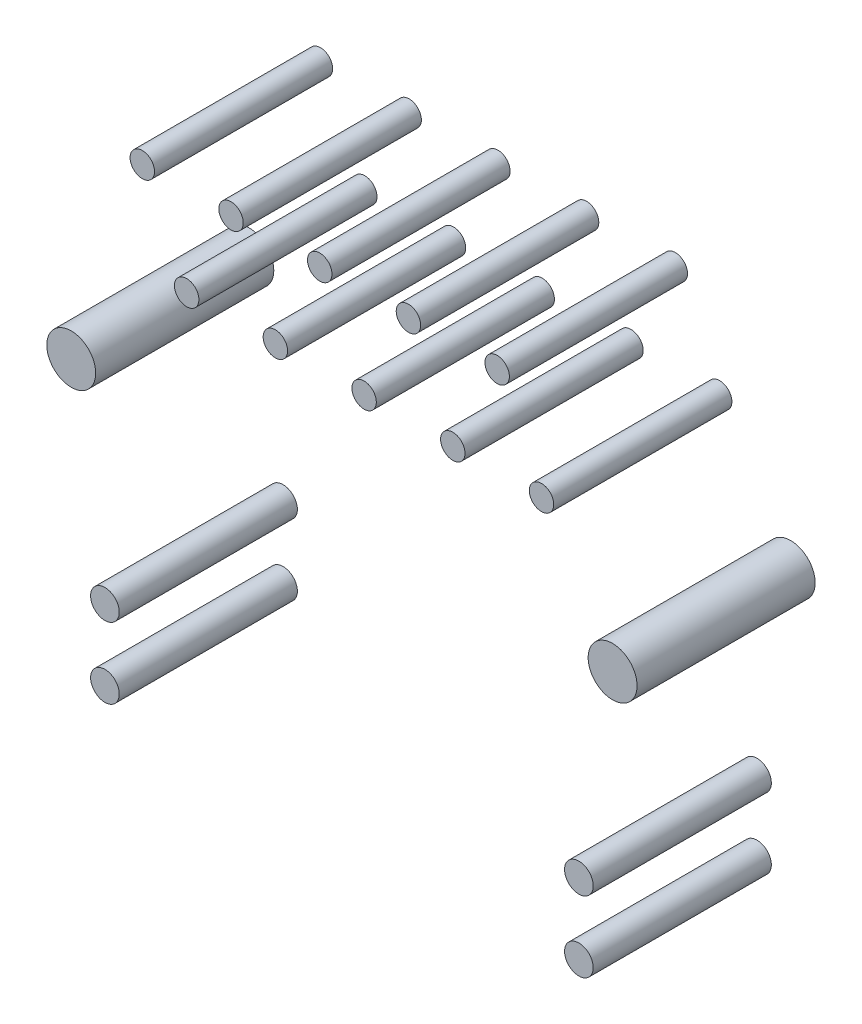
ISO-10303-21;
HEADER;
FILE_DESCRIPTION(('STEP AP214'),'2;1');
FILE_NAME('part.step','',(''),(''),'','','');
FILE_SCHEMA(('AUTOMOTIVE_DESIGN { 1 0 10303 214 1 1 1 1 }'));
ENDSEC;
DATA;
#1=APPLICATION_CONTEXT('core data for automotive mechanical design processes');
#2=APPLICATION_PROTOCOL_DEFINITION('international standard','automotive_design',2000,#1);
#3=PRODUCT_CONTEXT('',#1,'mechanical');
#4=PRODUCT('Part','Part','',(#3));
#5=PRODUCT_RELATED_PRODUCT_CATEGORY('part','',(#4));
#6=PRODUCT_DEFINITION_FORMATION('','',#4);
#7=PRODUCT_DEFINITION_CONTEXT('part definition',#1,'design');
#8=PRODUCT_DEFINITION('design','',#6,#7);
#9=PRODUCT_DEFINITION_SHAPE('','',#8);
#10=(LENGTH_UNIT() NAMED_UNIT(*) SI_UNIT(.MILLI.,.METRE.));
#11=(NAMED_UNIT(*) PLANE_ANGLE_UNIT() SI_UNIT($,.RADIAN.));
#12=(NAMED_UNIT(*) SI_UNIT($,.STERADIAN.) SOLID_ANGLE_UNIT());
#13=UNCERTAINTY_MEASURE_WITH_UNIT(LENGTH_MEASURE(1.E-05),#10,'distance_accuracy_value','');
#14=(GEOMETRIC_REPRESENTATION_CONTEXT(3) GLOBAL_UNCERTAINTY_ASSIGNED_CONTEXT((#13)) GLOBAL_UNIT_ASSIGNED_CONTEXT((#10,
#11,#12)) REPRESENTATION_CONTEXT('',''));
#15=CARTESIAN_POINT('',(0.,0.,0.));
#16=DIRECTION('',(0.,0.,1.));
#17=DIRECTION('',(1.,0.,0.));
#18=AXIS2_PLACEMENT_3D('',#15,#16,#17);
#19=CARTESIAN_POINT('',(-5.08,0.,0.1));
#20=DIRECTION('',(0.,0.,1.));
#21=DIRECTION('',(1.,0.,0.));
#22=AXIS2_PLACEMENT_3D('',#19,#20,#21);
#23=PLANE('',#22);
#24=CARTESIAN_POINT('',(-5.08,0.,0.1));
#25=DIRECTION('',(0.,0.,1.));
#26=DIRECTION('',(1.,0.,0.));
#27=AXIS2_PLACEMENT_3D('',#24,#25,#26);
#28=CIRCLE('',#27,0.35);
#29=CARTESIAN_POINT('',(-4.73,0.,0.1));
#30=VERTEX_POINT('',#29);
#31=EDGE_CURVE('P0_E18',#30,#30,#28,.F.);
#32=ORIENTED_EDGE('',*,*,#31,.F.);
#33=EDGE_LOOP('',(#32));
#34=FACE_BOUND('',#33,.T.);
#35=ADVANCED_FACE('P0_F15',(#34),#23,.T.);
#36=CARTESIAN_POINT('',(-5.08,0.,-5.));
#37=DIRECTION('',(0.,0.,1.));
#38=DIRECTION('',(1.,0.,0.));
#39=AXIS2_PLACEMENT_3D('',#36,#37,#38);
#40=PLANE('',#39);
#41=CARTESIAN_POINT('',(-5.08,0.,-5.));
#42=DIRECTION('',(0.,0.,1.));
#43=DIRECTION('',(1.,0.,0.));
#44=AXIS2_PLACEMENT_3D('',#41,#42,#43);
#45=CIRCLE('',#44,0.35);
#46=CARTESIAN_POINT('',(-4.73,0.,-5.));
#47=VERTEX_POINT('',#46);
#48=EDGE_CURVE('P0_E10',#47,#47,#45,.T.);
#49=ORIENTED_EDGE('',*,*,#48,.F.);
#50=EDGE_LOOP('',(#49));
#51=FACE_BOUND('',#50,.T.);
#52=ADVANCED_FACE('P0_F30',(#51),#40,.F.);
#53=CARTESIAN_POINT('',(-5.08,0.,-5.));
#54=DIRECTION('',(0.,0.,1.));
#55=DIRECTION('',(1.,0.,0.));
#56=AXIS2_PLACEMENT_3D('',#53,#54,#55);
#57=CYLINDRICAL_SURFACE('',#56,0.35);
#58=ORIENTED_EDGE('',*,*,#48,.T.);
#59=EDGE_LOOP('',(#58));
#60=FACE_BOUND('',#59,.T.);
#61=ORIENTED_EDGE('',*,*,#31,.T.);
#62=EDGE_LOOP('',(#61));
#63=FACE_BOUND('',#62,.T.);
#64=ADVANCED_FACE('P0_F27',(#60,#63),#57,.T.);
#65=CLOSED_SHELL('',(#35,#52,#64));
#66=MANIFOLD_SOLID_BREP('P0_B1',#65);
#67=CARTESIAN_POINT('',(-12.5,-10.92,0.1));
#68=DIRECTION('',(0.,0.,1.));
#69=DIRECTION('',(1.,0.,0.));
#70=AXIS2_PLACEMENT_3D('',#67,#68,#69);
#71=PLANE('',#70);
#72=CARTESIAN_POINT('',(-12.5,-10.92,0.1));
#73=DIRECTION('',(0.,0.,1.));
#74=DIRECTION('',(1.,0.,0.));
#75=AXIS2_PLACEMENT_3D('',#72,#73,#74);
#76=CIRCLE('',#75,0.41);
#77=CARTESIAN_POINT('',(-12.09,-10.92,0.1));
#78=VERTEX_POINT('',#77);
#79=EDGE_CURVE('P1_E18',#78,#78,#76,.F.);
#80=ORIENTED_EDGE('',*,*,#79,.F.);
#81=EDGE_LOOP('',(#80));
#82=FACE_BOUND('',#81,.T.);
#83=ADVANCED_FACE('P1_F15',(#82),#71,.T.);
#84=CARTESIAN_POINT('',(-12.5,-10.92,-5.));
#85=DIRECTION('',(0.,0.,1.));
#86=DIRECTION('',(1.,0.,0.));
#87=AXIS2_PLACEMENT_3D('',#84,#85,#86);
#88=PLANE('',#87);
#89=CARTESIAN_POINT('',(-12.5,-10.92,-5.));
#90=DIRECTION('',(0.,0.,1.));
#91=DIRECTION('',(1.,0.,0.));
#92=AXIS2_PLACEMENT_3D('',#89,#90,#91);
#93=CIRCLE('',#92,0.41);
#94=CARTESIAN_POINT('',(-12.09,-10.92,-5.));
#95=VERTEX_POINT('',#94);
#96=EDGE_CURVE('P1_E10',#95,#95,#93,.T.);
#97=ORIENTED_EDGE('',*,*,#96,.F.);
#98=EDGE_LOOP('',(#97));
#99=FACE_BOUND('',#98,.T.);
#100=ADVANCED_FACE('P1_F30',(#99),#88,.F.);
#101=CARTESIAN_POINT('',(-12.5,-10.92,-5.));
#102=DIRECTION('',(0.,0.,1.));
#103=DIRECTION('',(1.,0.,0.));
#104=AXIS2_PLACEMENT_3D('',#101,#102,#103);
#105=CYLINDRICAL_SURFACE('',#104,0.41);
#106=ORIENTED_EDGE('',*,*,#96,.T.);
#107=EDGE_LOOP('',(#106));
#108=FACE_BOUND('',#107,.T.);
#109=ORIENTED_EDGE('',*,*,#79,.T.);
#110=EDGE_LOOP('',(#109));
#111=FACE_BOUND('',#110,.T.);
#112=ADVANCED_FACE('P1_F27',(#108,#111),#105,.T.);
#113=CLOSED_SHELL('',(#83,#100,#112));
#114=MANIFOLD_SOLID_BREP('P1_B1',#113);
#115=CARTESIAN_POINT('',(-7.62,0.,0.1));
#116=DIRECTION('',(0.,0.,1.));
#117=DIRECTION('',(1.,0.,0.));
#118=AXIS2_PLACEMENT_3D('',#115,#116,#117);
#119=PLANE('',#118);
#120=CARTESIAN_POINT('',(-7.62,0.,0.1));
#121=DIRECTION('',(0.,0.,1.));
#122=DIRECTION('',(1.,0.,0.));
#123=AXIS2_PLACEMENT_3D('',#120,#121,#122);
#124=CIRCLE('',#123,0.35);
#125=CARTESIAN_POINT('',(-7.27,0.,0.1));
#126=VERTEX_POINT('',#125);
#127=EDGE_CURVE('P2_E18',#126,#126,#124,.F.);
#128=ORIENTED_EDGE('',*,*,#127,.F.);
#129=EDGE_LOOP('',(#128));
#130=FACE_BOUND('',#129,.T.);
#131=ADVANCED_FACE('P2_F15',(#130),#119,.T.);
#132=CARTESIAN_POINT('',(-7.62,0.,-5.));
#133=DIRECTION('',(0.,0.,1.));
#134=DIRECTION('',(1.,0.,0.));
#135=AXIS2_PLACEMENT_3D('',#132,#133,#134);
#136=PLANE('',#135);
#137=CARTESIAN_POINT('',(-7.62,0.,-5.));
#138=DIRECTION('',(0.,0.,1.));
#139=DIRECTION('',(1.,0.,0.));
#140=AXIS2_PLACEMENT_3D('',#137,#138,#139);
#141=CIRCLE('',#140,0.35);
#142=CARTESIAN_POINT('',(-7.27,0.,-5.));
#143=VERTEX_POINT('',#142);
#144=EDGE_CURVE('P2_E10',#143,#143,#141,.T.);
#145=ORIENTED_EDGE('',*,*,#144,.F.);
#146=EDGE_LOOP('',(#145));
#147=FACE_BOUND('',#146,.T.);
#148=ADVANCED_FACE('P2_F30',(#147),#136,.F.);
#149=CARTESIAN_POINT('',(-7.62,0.,-5.));
#150=DIRECTION('',(0.,0.,1.));
#151=DIRECTION('',(1.,0.,0.));
#152=AXIS2_PLACEMENT_3D('',#149,#150,#151);
#153=CYLINDRICAL_SURFACE('',#152,0.35);
#154=ORIENTED_EDGE('',*,*,#144,.T.);
#155=EDGE_LOOP('',(#154));
#156=FACE_BOUND('',#155,.T.);
#157=ORIENTED_EDGE('',*,*,#127,.T.);
#158=EDGE_LOOP('',(#157));
#159=FACE_BOUND('',#158,.T.);
#160=ADVANCED_FACE('P2_F27',(#156,#159),#153,.T.);
#161=CLOSED_SHELL('',(#131,#148,#160));
#162=MANIFOLD_SOLID_BREP('P2_B1',#161);
#163=CARTESIAN_POINT('',(-3.81,2.54,0.1));
#164=DIRECTION('',(0.,0.,1.));
#165=DIRECTION('',(1.,0.,0.));
#166=AXIS2_PLACEMENT_3D('',#163,#164,#165);
#167=PLANE('',#166);
#168=CARTESIAN_POINT('',(-3.81,2.54,0.1));
#169=DIRECTION('',(0.,0.,1.));
#170=DIRECTION('',(1.,0.,0.));
#171=AXIS2_PLACEMENT_3D('',#168,#169,#170);
#172=CIRCLE('',#171,0.35);
#173=CARTESIAN_POINT('',(-3.46,2.54,0.1));
#174=VERTEX_POINT('',#173);
#175=EDGE_CURVE('P3_E18',#174,#174,#172,.F.);
#176=ORIENTED_EDGE('',*,*,#175,.F.);
#177=EDGE_LOOP('',(#176));
#178=FACE_BOUND('',#177,.T.);
#179=ADVANCED_FACE('P3_F15',(#178),#167,.T.);
#180=CARTESIAN_POINT('',(-3.81,2.54,-5.));
#181=DIRECTION('',(0.,0.,1.));
#182=DIRECTION('',(1.,0.,0.));
#183=AXIS2_PLACEMENT_3D('',#180,#181,#182);
#184=PLANE('',#183);
#185=CARTESIAN_POINT('',(-3.81,2.54,-5.));
#186=DIRECTION('',(0.,0.,1.));
#187=DIRECTION('',(1.,0.,0.));
#188=AXIS2_PLACEMENT_3D('',#185,#186,#187);
#189=CIRCLE('',#188,0.35);
#190=CARTESIAN_POINT('',(-3.46,2.54,-5.));
#191=VERTEX_POINT('',#190);
#192=EDGE_CURVE('P3_E10',#191,#191,#189,.T.);
#193=ORIENTED_EDGE('',*,*,#192,.F.);
#194=EDGE_LOOP('',(#193));
#195=FACE_BOUND('',#194,.T.);
#196=ADVANCED_FACE('P3_F30',(#195),#184,.F.);
#197=CARTESIAN_POINT('',(-3.81,2.54,-5.));
#198=DIRECTION('',(0.,0.,1.));
#199=DIRECTION('',(1.,0.,0.));
#200=AXIS2_PLACEMENT_3D('',#197,#198,#199);
#201=CYLINDRICAL_SURFACE('',#200,0.35);
#202=ORIENTED_EDGE('',*,*,#192,.T.);
#203=EDGE_LOOP('',(#202));
#204=FACE_BOUND('',#203,.T.);
#205=ORIENTED_EDGE('',*,*,#175,.T.);
#206=EDGE_LOOP('',(#205));
#207=FACE_BOUND('',#206,.T.);
#208=ADVANCED_FACE('P3_F27',(#204,#207),#201,.T.);
#209=CLOSED_SHELL('',(#179,#196,#208));
#210=MANIFOLD_SOLID_BREP('P3_B1',#209);
#211=CARTESIAN_POINT('',(0.,0.,0.1));
#212=DIRECTION('',(0.,0.,1.));
#213=DIRECTION('',(1.,0.,0.));
#214=AXIS2_PLACEMENT_3D('',#211,#212,#213);
#215=PLANE('',#214);
#216=CARTESIAN_POINT('',(0.,0.,0.1));
#217=DIRECTION('',(0.,0.,1.));
#218=DIRECTION('',(1.,0.,0.));
#219=AXIS2_PLACEMENT_3D('',#216,#217,#218);
#220=CIRCLE('',#219,0.35);
#221=CARTESIAN_POINT('',(0.35,0.,0.1));
#222=VERTEX_POINT('',#221);
#223=EDGE_CURVE('P4_E18',#222,#222,#220,.F.);
#224=ORIENTED_EDGE('',*,*,#223,.F.);
#225=EDGE_LOOP('',(#224));
#226=FACE_BOUND('',#225,.T.);
#227=ADVANCED_FACE('P4_F15',(#226),#215,.T.);
#228=CARTESIAN_POINT('',(0.,0.,-5.));
#229=DIRECTION('',(0.,0.,1.));
#230=DIRECTION('',(1.,0.,0.));
#231=AXIS2_PLACEMENT_3D('',#228,#229,#230);
#232=PLANE('',#231);
#233=CARTESIAN_POINT('',(0.,0.,-5.));
#234=DIRECTION('',(0.,0.,1.));
#235=DIRECTION('',(1.,0.,0.));
#236=AXIS2_PLACEMENT_3D('',#233,#234,#235);
#237=CIRCLE('',#236,0.35);
#238=CARTESIAN_POINT('',(0.35,0.,-5.));
#239=VERTEX_POINT('',#238);
#240=EDGE_CURVE('P4_E10',#239,#239,#237,.T.);
#241=ORIENTED_EDGE('',*,*,#240,.F.);
#242=EDGE_LOOP('',(#241));
#243=FACE_BOUND('',#242,.T.);
#244=ADVANCED_FACE('P4_F30',(#243),#232,.F.);
#245=CARTESIAN_POINT('',(0.,0.,-5.));
#246=DIRECTION('',(0.,0.,1.));
#247=DIRECTION('',(1.,0.,0.));
#248=AXIS2_PLACEMENT_3D('',#245,#246,#247);
#249=CYLINDRICAL_SURFACE('',#248,0.35);
#250=ORIENTED_EDGE('',*,*,#240,.T.);
#251=EDGE_LOOP('',(#250));
#252=FACE_BOUND('',#251,.T.);
#253=ORIENTED_EDGE('',*,*,#223,.T.);
#254=EDGE_LOOP('',(#253));
#255=FACE_BOUND('',#254,.T.);
#256=ADVANCED_FACE('P4_F27',(#252,#255),#249,.T.);
#257=CLOSED_SHELL('',(#227,#244,#256));
#258=MANIFOLD_SOLID_BREP('P4_B1',#257);
#259=CARTESIAN_POINT('',(-2.54,0.,0.1));
#260=DIRECTION('',(0.,0.,1.));
#261=DIRECTION('',(1.,0.,0.));
#262=AXIS2_PLACEMENT_3D('',#259,#260,#261);
#263=PLANE('',#262);
#264=CARTESIAN_POINT('',(-2.54,0.,0.1));
#265=DIRECTION('',(0.,0.,1.));
#266=DIRECTION('',(1.,0.,0.));
#267=AXIS2_PLACEMENT_3D('',#264,#265,#266);
#268=CIRCLE('',#267,0.35);
#269=CARTESIAN_POINT('',(-2.19,0.,0.1));
#270=VERTEX_POINT('',#269);
#271=EDGE_CURVE('P5_E18',#270,#270,#268,.F.);
#272=ORIENTED_EDGE('',*,*,#271,.F.);
#273=EDGE_LOOP('',(#272));
#274=FACE_BOUND('',#273,.T.);
#275=ADVANCED_FACE('P5_F15',(#274),#263,.T.);
#276=CARTESIAN_POINT('',(-2.54,0.,-5.));
#277=DIRECTION('',(0.,0.,1.));
#278=DIRECTION('',(1.,0.,0.));
#279=AXIS2_PLACEMENT_3D('',#276,#277,#278);
#280=PLANE('',#279);
#281=CARTESIAN_POINT('',(-2.54,0.,-5.));
#282=DIRECTION('',(0.,0.,1.));
#283=DIRECTION('',(1.,0.,0.));
#284=AXIS2_PLACEMENT_3D('',#281,#282,#283);
#285=CIRCLE('',#284,0.35);
#286=CARTESIAN_POINT('',(-2.19,0.,-5.));
#287=VERTEX_POINT('',#286);
#288=EDGE_CURVE('P5_E10',#287,#287,#285,.T.);
#289=ORIENTED_EDGE('',*,*,#288,.F.);
#290=EDGE_LOOP('',(#289));
#291=FACE_BOUND('',#290,.T.);
#292=ADVANCED_FACE('P5_F30',(#291),#280,.F.);
#293=CARTESIAN_POINT('',(-2.54,0.,-5.));
#294=DIRECTION('',(0.,0.,1.));
#295=DIRECTION('',(1.,0.,0.));
#296=AXIS2_PLACEMENT_3D('',#293,#294,#295);
#297=CYLINDRICAL_SURFACE('',#296,0.35);
#298=ORIENTED_EDGE('',*,*,#288,.T.);
#299=EDGE_LOOP('',(#298));
#300=FACE_BOUND('',#299,.T.);
#301=ORIENTED_EDGE('',*,*,#271,.T.);
#302=EDGE_LOOP('',(#301));
#303=FACE_BOUND('',#302,.T.);
#304=ADVANCED_FACE('P5_F27',(#300,#303),#297,.T.);
#305=CLOSED_SHELL('',(#275,#292,#304));
#306=MANIFOLD_SOLID_BREP('P5_B1',#305);
#307=CARTESIAN_POINT('',(-1.27,2.54,0.1));
#308=DIRECTION('',(0.,0.,1.));
#309=DIRECTION('',(1.,0.,0.));
#310=AXIS2_PLACEMENT_3D('',#307,#308,#309);
#311=PLANE('',#310);
#312=CARTESIAN_POINT('',(-1.27,2.54,0.1));
#313=DIRECTION('',(0.,0.,1.));
#314=DIRECTION('',(1.,0.,0.));
#315=AXIS2_PLACEMENT_3D('',#312,#313,#314);
#316=CIRCLE('',#315,0.35);
#317=CARTESIAN_POINT('',(-0.92,2.54,0.1));
#318=VERTEX_POINT('',#317);
#319=EDGE_CURVE('P6_E18',#318,#318,#316,.F.);
#320=ORIENTED_EDGE('',*,*,#319,.F.);
#321=EDGE_LOOP('',(#320));
#322=FACE_BOUND('',#321,.T.);
#323=ADVANCED_FACE('P6_F15',(#322),#311,.T.);
#324=CARTESIAN_POINT('',(-1.27,2.54,-5.));
#325=DIRECTION('',(0.,0.,1.));
#326=DIRECTION('',(1.,0.,0.));
#327=AXIS2_PLACEMENT_3D('',#324,#325,#326);
#328=PLANE('',#327);
#329=CARTESIAN_POINT('',(-1.27,2.54,-5.));
#330=DIRECTION('',(0.,0.,1.));
#331=DIRECTION('',(1.,0.,0.));
#332=AXIS2_PLACEMENT_3D('',#329,#330,#331);
#333=CIRCLE('',#332,0.35);
#334=CARTESIAN_POINT('',(-0.92,2.54,-5.));
#335=VERTEX_POINT('',#334);
#336=EDGE_CURVE('P6_E10',#335,#335,#333,.T.);
#337=ORIENTED_EDGE('',*,*,#336,.F.);
#338=EDGE_LOOP('',(#337));
#339=FACE_BOUND('',#338,.T.);
#340=ADVANCED_FACE('P6_F30',(#339),#328,.F.);
#341=CARTESIAN_POINT('',(-1.27,2.54,-5.));
#342=DIRECTION('',(0.,0.,1.));
#343=DIRECTION('',(1.,0.,0.));
#344=AXIS2_PLACEMENT_3D('',#341,#342,#343);
#345=CYLINDRICAL_SURFACE('',#344,0.35);
#346=ORIENTED_EDGE('',*,*,#336,.T.);
#347=EDGE_LOOP('',(#346));
#348=FACE_BOUND('',#347,.T.);
#349=ORIENTED_EDGE('',*,*,#319,.T.);
#350=EDGE_LOOP('',(#349));
#351=FACE_BOUND('',#350,.T.);
#352=ADVANCED_FACE('P6_F27',(#348,#351),#345,.T.);
#353=CLOSED_SHELL('',(#323,#340,#352));
#354=MANIFOLD_SOLID_BREP('P6_B1',#353);
#355=CARTESIAN_POINT('',(-12.5,-8.89,0.1));
#356=DIRECTION('',(0.,0.,1.));
#357=DIRECTION('',(1.,0.,0.));
#358=AXIS2_PLACEMENT_3D('',#355,#356,#357);
#359=PLANE('',#358);
#360=CARTESIAN_POINT('',(-12.5,-8.89,0.1));
#361=DIRECTION('',(0.,0.,1.));
#362=DIRECTION('',(1.,0.,0.));
#363=AXIS2_PLACEMENT_3D('',#360,#361,#362);
#364=CIRCLE('',#363,0.41);
#365=CARTESIAN_POINT('',(-12.09,-8.89,0.1));
#366=VERTEX_POINT('',#365);
#367=EDGE_CURVE('P7_E18',#366,#366,#364,.F.);
#368=ORIENTED_EDGE('',*,*,#367,.F.);
#369=EDGE_LOOP('',(#368));
#370=FACE_BOUND('',#369,.T.);
#371=ADVANCED_FACE('P7_F15',(#370),#359,.T.);
#372=CARTESIAN_POINT('',(-12.5,-8.89,-5.));
#373=DIRECTION('',(0.,0.,1.));
#374=DIRECTION('',(1.,0.,0.));
#375=AXIS2_PLACEMENT_3D('',#372,#373,#374);
#376=PLANE('',#375);
#377=CARTESIAN_POINT('',(-12.5,-8.89,-5.));
#378=DIRECTION('',(0.,0.,1.));
#379=DIRECTION('',(1.,0.,0.));
#380=AXIS2_PLACEMENT_3D('',#377,#378,#379);
#381=CIRCLE('',#380,0.41);
#382=CARTESIAN_POINT('',(-12.09,-8.89,-5.));
#383=VERTEX_POINT('',#382);
#384=EDGE_CURVE('P7_E10',#383,#383,#381,.T.);
#385=ORIENTED_EDGE('',*,*,#384,.F.);
#386=EDGE_LOOP('',(#385));
#387=FACE_BOUND('',#386,.T.);
#388=ADVANCED_FACE('P7_F30',(#387),#376,.F.);
#389=CARTESIAN_POINT('',(-12.5,-8.89,-5.));
#390=DIRECTION('',(0.,0.,1.));
#391=DIRECTION('',(1.,0.,0.));
#392=AXIS2_PLACEMENT_3D('',#389,#390,#391);
#393=CYLINDRICAL_SURFACE('',#392,0.41);
#394=ORIENTED_EDGE('',*,*,#384,.T.);
#395=EDGE_LOOP('',(#394));
#396=FACE_BOUND('',#395,.T.);
#397=ORIENTED_EDGE('',*,*,#367,.T.);
#398=EDGE_LOOP('',(#397));
#399=FACE_BOUND('',#398,.T.);
#400=ADVANCED_FACE('P7_F27',(#396,#399),#393,.T.);
#401=CLOSED_SHELL('',(#371,#388,#400));
#402=MANIFOLD_SOLID_BREP('P7_B1',#401);
#403=CARTESIAN_POINT('',(1.07,-10.92,0.1));
#404=DIRECTION('',(0.,0.,1.));
#405=DIRECTION('',(1.,0.,0.));
#406=AXIS2_PLACEMENT_3D('',#403,#404,#405);
#407=PLANE('',#406);
#408=CARTESIAN_POINT('',(1.07,-10.92,0.1));
#409=DIRECTION('',(0.,0.,1.));
#410=DIRECTION('',(1.,0.,0.));
#411=AXIS2_PLACEMENT_3D('',#408,#409,#410);
#412=CIRCLE('',#411,0.41);
#413=CARTESIAN_POINT('',(1.48,-10.92,0.1));
#414=VERTEX_POINT('',#413);
#415=EDGE_CURVE('P8_E18',#414,#414,#412,.F.);
#416=ORIENTED_EDGE('',*,*,#415,.F.);
#417=EDGE_LOOP('',(#416));
#418=FACE_BOUND('',#417,.T.);
#419=ADVANCED_FACE('P8_F15',(#418),#407,.T.);
#420=CARTESIAN_POINT('',(1.07,-10.92,-5.));
#421=DIRECTION('',(0.,0.,1.));
#422=DIRECTION('',(1.,0.,0.));
#423=AXIS2_PLACEMENT_3D('',#420,#421,#422);
#424=PLANE('',#423);
#425=CARTESIAN_POINT('',(1.07,-10.92,-5.));
#426=DIRECTION('',(0.,0.,1.));
#427=DIRECTION('',(1.,0.,0.));
#428=AXIS2_PLACEMENT_3D('',#425,#426,#427);
#429=CIRCLE('',#428,0.41);
#430=CARTESIAN_POINT('',(1.48,-10.92,-5.));
#431=VERTEX_POINT('',#430);
#432=EDGE_CURVE('P8_E10',#431,#431,#429,.T.);
#433=ORIENTED_EDGE('',*,*,#432,.F.);
#434=EDGE_LOOP('',(#433));
#435=FACE_BOUND('',#434,.T.);
#436=ADVANCED_FACE('P8_F30',(#435),#424,.F.);
#437=CARTESIAN_POINT('',(1.07,-10.92,-5.));
#438=DIRECTION('',(0.,0.,1.));
#439=DIRECTION('',(1.,0.,0.));
#440=AXIS2_PLACEMENT_3D('',#437,#438,#439);
#441=CYLINDRICAL_SURFACE('',#440,0.41);
#442=ORIENTED_EDGE('',*,*,#432,.T.);
#443=EDGE_LOOP('',(#442));
#444=FACE_BOUND('',#443,.T.);
#445=ORIENTED_EDGE('',*,*,#415,.T.);
#446=EDGE_LOOP('',(#445));
#447=FACE_BOUND('',#446,.T.);
#448=ADVANCED_FACE('P8_F27',(#444,#447),#441,.T.);
#449=CLOSED_SHELL('',(#419,#436,#448));
#450=MANIFOLD_SOLID_BREP('P8_B1',#449);
#451=CARTESIAN_POINT('',(2.035,-3.3,0.1));
#452=DIRECTION('',(0.,0.,1.));
#453=DIRECTION('',(1.,0.,0.));
#454=AXIS2_PLACEMENT_3D('',#451,#452,#453);
#455=PLANE('',#454);
#456=CARTESIAN_POINT('',(2.035,-3.3,0.1));
#457=DIRECTION('',(0.,0.,1.));
#458=DIRECTION('',(1.,0.,0.));
#459=AXIS2_PLACEMENT_3D('',#456,#457,#458);
#460=CIRCLE('',#459,0.7);
#461=CARTESIAN_POINT('',(2.735,-3.3,0.1));
#462=VERTEX_POINT('',#461);
#463=EDGE_CURVE('P9_E18',#462,#462,#460,.F.);
#464=ORIENTED_EDGE('',*,*,#463,.F.);
#465=EDGE_LOOP('',(#464));
#466=FACE_BOUND('',#465,.T.);
#467=ADVANCED_FACE('P9_F15',(#466),#455,.T.);
#468=CARTESIAN_POINT('',(2.035,-3.3,-5.));
#469=DIRECTION('',(0.,0.,1.));
#470=DIRECTION('',(1.,0.,0.));
#471=AXIS2_PLACEMENT_3D('',#468,#469,#470);
#472=PLANE('',#471);
#473=CARTESIAN_POINT('',(2.035,-3.3,-5.));
#474=DIRECTION('',(0.,0.,1.));
#475=DIRECTION('',(1.,0.,0.));
#476=AXIS2_PLACEMENT_3D('',#473,#474,#475);
#477=CIRCLE('',#476,0.7);
#478=CARTESIAN_POINT('',(2.735,-3.3,-5.));
#479=VERTEX_POINT('',#478);
#480=EDGE_CURVE('P9_E10',#479,#479,#477,.T.);
#481=ORIENTED_EDGE('',*,*,#480,.F.);
#482=EDGE_LOOP('',(#481));
#483=FACE_BOUND('',#482,.T.);
#484=ADVANCED_FACE('P9_F30',(#483),#472,.F.);
#485=CARTESIAN_POINT('',(2.035,-3.3,-5.));
#486=DIRECTION('',(0.,0.,1.));
#487=DIRECTION('',(1.,0.,0.));
#488=AXIS2_PLACEMENT_3D('',#485,#486,#487);
#489=CYLINDRICAL_SURFACE('',#488,0.7);
#490=ORIENTED_EDGE('',*,*,#480,.T.);
#491=EDGE_LOOP('',(#490));
#492=FACE_BOUND('',#491,.T.);
#493=ORIENTED_EDGE('',*,*,#463,.T.);
#494=EDGE_LOOP('',(#493));
#495=FACE_BOUND('',#494,.T.);
#496=ADVANCED_FACE('P9_F27',(#492,#495),#489,.T.);
#497=CLOSED_SHELL('',(#467,#484,#496));
#498=MANIFOLD_SOLID_BREP('P9_B1',#497);
#499=CARTESIAN_POINT('',(1.07,-8.89,0.1));
#500=DIRECTION('',(0.,0.,1.));
#501=DIRECTION('',(1.,0.,0.));
#502=AXIS2_PLACEMENT_3D('',#499,#500,#501);
#503=PLANE('',#502);
#504=CARTESIAN_POINT('',(1.07,-8.89,0.1));
#505=DIRECTION('',(0.,0.,1.));
#506=DIRECTION('',(1.,0.,0.));
#507=AXIS2_PLACEMENT_3D('',#504,#505,#506);
#508=CIRCLE('',#507,0.41);
#509=CARTESIAN_POINT('',(1.48,-8.89,0.1));
#510=VERTEX_POINT('',#509);
#511=EDGE_CURVE('P10_E18',#510,#510,#508,.F.);
#512=ORIENTED_EDGE('',*,*,#511,.F.);
#513=EDGE_LOOP('',(#512));
#514=FACE_BOUND('',#513,.T.);
#515=ADVANCED_FACE('P10_F15',(#514),#503,.T.);
#516=CARTESIAN_POINT('',(1.07,-8.89,-5.));
#517=DIRECTION('',(0.,0.,1.));
#518=DIRECTION('',(1.,0.,0.));
#519=AXIS2_PLACEMENT_3D('',#516,#517,#518);
#520=PLANE('',#519);
#521=CARTESIAN_POINT('',(1.07,-8.89,-5.));
#522=DIRECTION('',(0.,0.,1.));
#523=DIRECTION('',(1.,0.,0.));
#524=AXIS2_PLACEMENT_3D('',#521,#522,#523);
#525=CIRCLE('',#524,0.41);
#526=CARTESIAN_POINT('',(1.48,-8.89,-5.));
#527=VERTEX_POINT('',#526);
#528=EDGE_CURVE('P10_E10',#527,#527,#525,.T.);
#529=ORIENTED_EDGE('',*,*,#528,.F.);
#530=EDGE_LOOP('',(#529));
#531=FACE_BOUND('',#530,.T.);
#532=ADVANCED_FACE('P10_F30',(#531),#520,.F.);
#533=CARTESIAN_POINT('',(1.07,-8.89,-5.));
#534=DIRECTION('',(0.,0.,1.));
#535=DIRECTION('',(1.,0.,0.));
#536=AXIS2_PLACEMENT_3D('',#533,#534,#535);
#537=CYLINDRICAL_SURFACE('',#536,0.41);
#538=ORIENTED_EDGE('',*,*,#528,.T.);
#539=EDGE_LOOP('',(#538));
#540=FACE_BOUND('',#539,.T.);
#541=ORIENTED_EDGE('',*,*,#511,.T.);
#542=EDGE_LOOP('',(#541));
#543=FACE_BOUND('',#542,.T.);
#544=ADVANCED_FACE('P10_F27',(#540,#543),#537,.T.);
#545=CLOSED_SHELL('',(#515,#532,#544));
#546=MANIFOLD_SOLID_BREP('P10_B1',#545);
#547=CARTESIAN_POINT('',(-11.43,2.54,0.1));
#548=DIRECTION('',(0.,0.,1.));
#549=DIRECTION('',(1.,0.,0.));
#550=AXIS2_PLACEMENT_3D('',#547,#548,#549);
#551=PLANE('',#550);
#552=CARTESIAN_POINT('',(-11.43,2.54,0.1));
#553=DIRECTION('',(0.,0.,1.));
#554=DIRECTION('',(1.,0.,0.));
#555=AXIS2_PLACEMENT_3D('',#552,#553,#554);
#556=CIRCLE('',#555,0.35);
#557=CARTESIAN_POINT('',(-11.08,2.54,0.1));
#558=VERTEX_POINT('',#557);
#559=EDGE_CURVE('P11_E18',#558,#558,#556,.F.);
#560=ORIENTED_EDGE('',*,*,#559,.F.);
#561=EDGE_LOOP('',(#560));
#562=FACE_BOUND('',#561,.T.);
#563=ADVANCED_FACE('P11_F15',(#562),#551,.T.);
#564=CARTESIAN_POINT('',(-11.43,2.54,-5.));
#565=DIRECTION('',(0.,0.,1.));
#566=DIRECTION('',(1.,0.,0.));
#567=AXIS2_PLACEMENT_3D('',#564,#565,#566);
#568=PLANE('',#567);
#569=CARTESIAN_POINT('',(-11.43,2.54,-5.));
#570=DIRECTION('',(0.,0.,1.));
#571=DIRECTION('',(1.,0.,0.));
#572=AXIS2_PLACEMENT_3D('',#569,#570,#571);
#573=CIRCLE('',#572,0.35);
#574=CARTESIAN_POINT('',(-11.08,2.54,-5.));
#575=VERTEX_POINT('',#574);
#576=EDGE_CURVE('P11_E10',#575,#575,#573,.T.);
#577=ORIENTED_EDGE('',*,*,#576,.F.);
#578=EDGE_LOOP('',(#577));
#579=FACE_BOUND('',#578,.T.);
#580=ADVANCED_FACE('P11_F30',(#579),#568,.F.);
#581=CARTESIAN_POINT('',(-11.43,2.54,-5.));
#582=DIRECTION('',(0.,0.,1.));
#583=DIRECTION('',(1.,0.,0.));
#584=AXIS2_PLACEMENT_3D('',#581,#582,#583);
#585=CYLINDRICAL_SURFACE('',#584,0.35);
#586=ORIENTED_EDGE('',*,*,#576,.T.);
#587=EDGE_LOOP('',(#586));
#588=FACE_BOUND('',#587,.T.);
#589=ORIENTED_EDGE('',*,*,#559,.T.);
#590=EDGE_LOOP('',(#589));
#591=FACE_BOUND('',#590,.T.);
#592=ADVANCED_FACE('P11_F27',(#588,#591),#585,.T.);
#593=CLOSED_SHELL('',(#563,#580,#592));
#594=MANIFOLD_SOLID_BREP('P11_B1',#593);
#595=CARTESIAN_POINT('',(-6.35,2.54,0.1));
#596=DIRECTION('',(0.,0.,1.));
#597=DIRECTION('',(1.,0.,0.));
#598=AXIS2_PLACEMENT_3D('',#595,#596,#597);
#599=PLANE('',#598);
#600=CARTESIAN_POINT('',(-6.35,2.54,0.1));
#601=DIRECTION('',(0.,0.,1.));
#602=DIRECTION('',(1.,0.,0.));
#603=AXIS2_PLACEMENT_3D('',#600,#601,#602);
#604=CIRCLE('',#603,0.35);
#605=CARTESIAN_POINT('',(-6.,2.54,0.1));
#606=VERTEX_POINT('',#605);
#607=EDGE_CURVE('P12_E18',#606,#606,#604,.F.);
#608=ORIENTED_EDGE('',*,*,#607,.F.);
#609=EDGE_LOOP('',(#608));
#610=FACE_BOUND('',#609,.T.);
#611=ADVANCED_FACE('P12_F15',(#610),#599,.T.);
#612=CARTESIAN_POINT('',(-6.35,2.54,-5.));
#613=DIRECTION('',(0.,0.,1.));
#614=DIRECTION('',(1.,0.,0.));
#615=AXIS2_PLACEMENT_3D('',#612,#613,#614);
#616=PLANE('',#615);
#617=CARTESIAN_POINT('',(-6.35,2.54,-5.));
#618=DIRECTION('',(0.,0.,1.));
#619=DIRECTION('',(1.,0.,0.));
#620=AXIS2_PLACEMENT_3D('',#617,#618,#619);
#621=CIRCLE('',#620,0.35);
#622=CARTESIAN_POINT('',(-6.,2.54,-5.));
#623=VERTEX_POINT('',#622);
#624=EDGE_CURVE('P12_E10',#623,#623,#621,.T.);
#625=ORIENTED_EDGE('',*,*,#624,.F.);
#626=EDGE_LOOP('',(#625));
#627=FACE_BOUND('',#626,.T.);
#628=ADVANCED_FACE('P12_F30',(#627),#616,.F.);
#629=CARTESIAN_POINT('',(-6.35,2.54,-5.));
#630=DIRECTION('',(0.,0.,1.));
#631=DIRECTION('',(1.,0.,0.));
#632=AXIS2_PLACEMENT_3D('',#629,#630,#631);
#633=CYLINDRICAL_SURFACE('',#632,0.35);
#634=ORIENTED_EDGE('',*,*,#624,.T.);
#635=EDGE_LOOP('',(#634));
#636=FACE_BOUND('',#635,.T.);
#637=ORIENTED_EDGE('',*,*,#607,.T.);
#638=EDGE_LOOP('',(#637));
#639=FACE_BOUND('',#638,.T.);
#640=ADVANCED_FACE('P12_F27',(#636,#639),#633,.T.);
#641=CLOSED_SHELL('',(#611,#628,#640));
#642=MANIFOLD_SOLID_BREP('P12_B1',#641);
#643=CARTESIAN_POINT('',(-8.89,2.54,0.1));
#644=DIRECTION('',(0.,0.,1.));
#645=DIRECTION('',(1.,0.,0.));
#646=AXIS2_PLACEMENT_3D('',#643,#644,#645);
#647=PLANE('',#646);
#648=CARTESIAN_POINT('',(-8.89,2.54,0.1));
#649=DIRECTION('',(0.,0.,1.));
#650=DIRECTION('',(1.,0.,0.));
#651=AXIS2_PLACEMENT_3D('',#648,#649,#650);
#652=CIRCLE('',#651,0.35);
#653=CARTESIAN_POINT('',(-8.54,2.54,0.1));
#654=VERTEX_POINT('',#653);
#655=EDGE_CURVE('P13_E18',#654,#654,#652,.F.);
#656=ORIENTED_EDGE('',*,*,#655,.F.);
#657=EDGE_LOOP('',(#656));
#658=FACE_BOUND('',#657,.T.);
#659=ADVANCED_FACE('P13_F15',(#658),#647,.T.);
#660=CARTESIAN_POINT('',(-8.89,2.54,-5.));
#661=DIRECTION('',(0.,0.,1.));
#662=DIRECTION('',(1.,0.,0.));
#663=AXIS2_PLACEMENT_3D('',#660,#661,#662);
#664=PLANE('',#663);
#665=CARTESIAN_POINT('',(-8.89,2.54,-5.));
#666=DIRECTION('',(0.,0.,1.));
#667=DIRECTION('',(1.,0.,0.));
#668=AXIS2_PLACEMENT_3D('',#665,#666,#667);
#669=CIRCLE('',#668,0.35);
#670=CARTESIAN_POINT('',(-8.54,2.54,-5.));
#671=VERTEX_POINT('',#670);
#672=EDGE_CURVE('P13_E10',#671,#671,#669,.T.);
#673=ORIENTED_EDGE('',*,*,#672,.F.);
#674=EDGE_LOOP('',(#673));
#675=FACE_BOUND('',#674,.T.);
#676=ADVANCED_FACE('P13_F30',(#675),#664,.F.);
#677=CARTESIAN_POINT('',(-8.89,2.54,-5.));
#678=DIRECTION('',(0.,0.,1.));
#679=DIRECTION('',(1.,0.,0.));
#680=AXIS2_PLACEMENT_3D('',#677,#678,#679);
#681=CYLINDRICAL_SURFACE('',#680,0.35);
#682=ORIENTED_EDGE('',*,*,#672,.T.);
#683=EDGE_LOOP('',(#682));
#684=FACE_BOUND('',#683,.T.);
#685=ORIENTED_EDGE('',*,*,#655,.T.);
#686=EDGE_LOOP('',(#685));
#687=FACE_BOUND('',#686,.T.);
#688=ADVANCED_FACE('P13_F27',(#684,#687),#681,.T.);
#689=CLOSED_SHELL('',(#659,#676,#688));
#690=MANIFOLD_SOLID_BREP('P13_B1',#689);
#691=CARTESIAN_POINT('',(-10.16,0.,0.1));
#692=DIRECTION('',(0.,0.,1.));
#693=DIRECTION('',(1.,0.,0.));
#694=AXIS2_PLACEMENT_3D('',#691,#692,#693);
#695=PLANE('',#694);
#696=CARTESIAN_POINT('',(-10.16,0.,0.1));
#697=DIRECTION('',(0.,0.,1.));
#698=DIRECTION('',(1.,0.,0.));
#699=AXIS2_PLACEMENT_3D('',#696,#697,#698);
#700=CIRCLE('',#699,0.35);
#701=CARTESIAN_POINT('',(-9.81,0.,0.1));
#702=VERTEX_POINT('',#701);
#703=EDGE_CURVE('P14_E18',#702,#702,#700,.F.);
#704=ORIENTED_EDGE('',*,*,#703,.F.);
#705=EDGE_LOOP('',(#704));
#706=FACE_BOUND('',#705,.T.);
#707=ADVANCED_FACE('P14_F15',(#706),#695,.T.);
#708=CARTESIAN_POINT('',(-10.16,0.,-5.));
#709=DIRECTION('',(0.,0.,1.));
#710=DIRECTION('',(1.,0.,0.));
#711=AXIS2_PLACEMENT_3D('',#708,#709,#710);
#712=PLANE('',#711);
#713=CARTESIAN_POINT('',(-10.16,0.,-5.));
#714=DIRECTION('',(0.,0.,1.));
#715=DIRECTION('',(1.,0.,0.));
#716=AXIS2_PLACEMENT_3D('',#713,#714,#715);
#717=CIRCLE('',#716,0.35);
#718=CARTESIAN_POINT('',(-9.81,0.,-5.));
#719=VERTEX_POINT('',#718);
#720=EDGE_CURVE('P14_E10',#719,#719,#717,.T.);
#721=ORIENTED_EDGE('',*,*,#720,.F.);
#722=EDGE_LOOP('',(#721));
#723=FACE_BOUND('',#722,.T.);
#724=ADVANCED_FACE('P14_F30',(#723),#712,.F.);
#725=CARTESIAN_POINT('',(-10.16,0.,-5.));
#726=DIRECTION('',(0.,0.,1.));
#727=DIRECTION('',(1.,0.,0.));
#728=AXIS2_PLACEMENT_3D('',#725,#726,#727);
#729=CYLINDRICAL_SURFACE('',#728,0.35);
#730=ORIENTED_EDGE('',*,*,#720,.T.);
#731=EDGE_LOOP('',(#730));
#732=FACE_BOUND('',#731,.T.);
#733=ORIENTED_EDGE('',*,*,#703,.T.);
#734=EDGE_LOOP('',(#733));
#735=FACE_BOUND('',#734,.T.);
#736=ADVANCED_FACE('P14_F27',(#732,#735),#729,.T.);
#737=CLOSED_SHELL('',(#707,#724,#736));
#738=MANIFOLD_SOLID_BREP('P14_B1',#737);
#739=CARTESIAN_POINT('',(-13.465,-3.3,0.1));
#740=DIRECTION('',(0.,0.,1.));
#741=DIRECTION('',(1.,0.,0.));
#742=AXIS2_PLACEMENT_3D('',#739,#740,#741);
#743=PLANE('',#742);
#744=CARTESIAN_POINT('',(-13.465,-3.3,0.1));
#745=DIRECTION('',(0.,0.,1.));
#746=DIRECTION('',(1.,0.,0.));
#747=AXIS2_PLACEMENT_3D('',#744,#745,#746);
#748=CIRCLE('',#747,0.7);
#749=CARTESIAN_POINT('',(-12.765,-3.3,0.1));
#750=VERTEX_POINT('',#749);
#751=EDGE_CURVE('P15_E18',#750,#750,#748,.F.);
#752=ORIENTED_EDGE('',*,*,#751,.F.);
#753=EDGE_LOOP('',(#752));
#754=FACE_BOUND('',#753,.T.);
#755=ADVANCED_FACE('P15_F15',(#754),#743,.T.);
#756=CARTESIAN_POINT('',(-13.465,-3.3,-5.));
#757=DIRECTION('',(0.,0.,1.));
#758=DIRECTION('',(1.,0.,0.));
#759=AXIS2_PLACEMENT_3D('',#756,#757,#758);
#760=PLANE('',#759);
#761=CARTESIAN_POINT('',(-13.465,-3.3,-5.));
#762=DIRECTION('',(0.,0.,1.));
#763=DIRECTION('',(1.,0.,0.));
#764=AXIS2_PLACEMENT_3D('',#761,#762,#763);
#765=CIRCLE('',#764,0.7);
#766=CARTESIAN_POINT('',(-12.765,-3.3,-5.));
#767=VERTEX_POINT('',#766);
#768=EDGE_CURVE('P15_E10',#767,#767,#765,.T.);
#769=ORIENTED_EDGE('',*,*,#768,.F.);
#770=EDGE_LOOP('',(#769));
#771=FACE_BOUND('',#770,.T.);
#772=ADVANCED_FACE('P15_F30',(#771),#760,.F.);
#773=CARTESIAN_POINT('',(-13.465,-3.3,-5.));
#774=DIRECTION('',(0.,0.,1.));
#775=DIRECTION('',(1.,0.,0.));
#776=AXIS2_PLACEMENT_3D('',#773,#774,#775);
#777=CYLINDRICAL_SURFACE('',#776,0.7);
#778=ORIENTED_EDGE('',*,*,#768,.T.);
#779=EDGE_LOOP('',(#778));
#780=FACE_BOUND('',#779,.T.);
#781=ORIENTED_EDGE('',*,*,#751,.T.);
#782=EDGE_LOOP('',(#781));
#783=FACE_BOUND('',#782,.T.);
#784=ADVANCED_FACE('P15_F27',(#780,#783),#777,.T.);
#785=CLOSED_SHELL('',(#755,#772,#784));
#786=MANIFOLD_SOLID_BREP('P15_B1',#785);
#787=ADVANCED_BREP_SHAPE_REPRESENTATION('',(#18,#66,#114,#162,#210,#258,#306,#354,#402,#450,
#498,#546,#594,#642,#690,#738,#786),#14);
#788=SHAPE_DEFINITION_REPRESENTATION(#9,#787);
ENDSEC;
END-ISO-10303-21;
